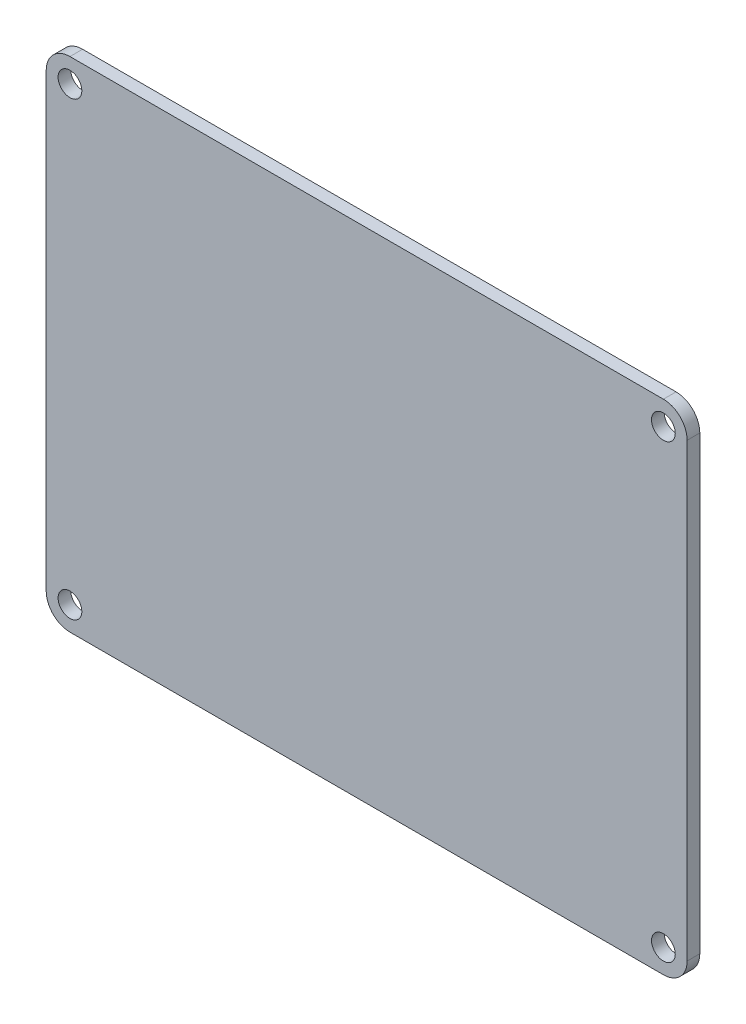
ISO-10303-21;
HEADER;
FILE_DESCRIPTION(('STEP AP214'),'2;1');
FILE_NAME('part.step','',(''),(''),'','','');
FILE_SCHEMA(('AUTOMOTIVE_DESIGN { 1 0 10303 214 1 1 1 1 }'));
ENDSEC;
DATA;
#1=APPLICATION_CONTEXT('core data for automotive mechanical design processes');
#2=APPLICATION_PROTOCOL_DEFINITION('international standard','automotive_design',2000,#1);
#3=PRODUCT_CONTEXT('',#1,'mechanical');
#4=PRODUCT('Part','Part','',(#3));
#5=PRODUCT_RELATED_PRODUCT_CATEGORY('part','',(#4));
#6=PRODUCT_DEFINITION_FORMATION('','',#4);
#7=PRODUCT_DEFINITION_CONTEXT('part definition',#1,'design');
#8=PRODUCT_DEFINITION('design','',#6,#7);
#9=PRODUCT_DEFINITION_SHAPE('','',#8);
#10=(LENGTH_UNIT() NAMED_UNIT(*) SI_UNIT(.MILLI.,.METRE.));
#11=(NAMED_UNIT(*) PLANE_ANGLE_UNIT() SI_UNIT($,.RADIAN.));
#12=(NAMED_UNIT(*) SI_UNIT($,.STERADIAN.) SOLID_ANGLE_UNIT());
#13=UNCERTAINTY_MEASURE_WITH_UNIT(LENGTH_MEASURE(1.E-05),#10,'distance_accuracy_value','');
#14=(GEOMETRIC_REPRESENTATION_CONTEXT(3) GLOBAL_UNCERTAINTY_ASSIGNED_CONTEXT((#13)) GLOBAL_UNIT_ASSIGNED_CONTEXT((#10,
#11,#12)) REPRESENTATION_CONTEXT('',''));
#15=CARTESIAN_POINT('',(0.,0.,0.));
#16=DIRECTION('',(0.,0.,1.));
#17=DIRECTION('',(1.,0.,0.));
#18=AXIS2_PLACEMENT_3D('',#15,#16,#17);
#19=CARTESIAN_POINT('',(-37.5,-28.5,1.6));
#20=DIRECTION('',(0.,0.,-1.));
#21=DIRECTION('',(-1.,0.,0.));
#22=AXIS2_PLACEMENT_3D('',#19,#20,#21);
#23=PLANE('',#22);
#24=CARTESIAN_POINT('',(-37.5,-28.5,1.6));
#25=DIRECTION('',(0.,0.,1.));
#26=DIRECTION('',(-1.,0.,0.));
#27=AXIS2_PLACEMENT_3D('',#24,#25,#26);
#28=CIRCLE('',#27,3.);
#29=CARTESIAN_POINT('',(-40.5,-28.5,1.6));
#30=VERTEX_POINT('',#29);
#31=CARTESIAN_POINT('',(-37.5,-31.5,1.6));
#32=VERTEX_POINT('',#31);
#33=EDGE_CURVE('E164',#30,#32,#28,.T.);
#34=ORIENTED_EDGE('',*,*,#33,.T.);
#35=DIRECTION('',(1.,0.,0.));
#36=VECTOR('',#35,1.);
#37=CARTESIAN_POINT('',(-37.5,-31.5,1.6));
#38=LINE('',#37,#36);
#39=CARTESIAN_POINT('',(37.5,-31.5,1.6));
#40=VERTEX_POINT('',#39);
#41=EDGE_CURVE('E100',#32,#40,#38,.T.);
#42=ORIENTED_EDGE('',*,*,#41,.T.);
#43=CARTESIAN_POINT('',(37.5,-28.5,1.6));
#44=DIRECTION('',(0.,0.,1.));
#45=DIRECTION('',(1.,0.,0.));
#46=AXIS2_PLACEMENT_3D('',#43,#44,#45);
#47=CIRCLE('',#46,3.);
#48=CARTESIAN_POINT('',(40.5,-28.5,1.6));
#49=VERTEX_POINT('',#48);
#50=EDGE_CURVE('E185',#40,#49,#47,.T.);
#51=ORIENTED_EDGE('',*,*,#50,.T.);
#52=DIRECTION('',(0.,1.,0.));
#53=VECTOR('',#52,1.);
#54=CARTESIAN_POINT('',(40.5,-28.5,1.6));
#55=LINE('',#54,#53);
#56=CARTESIAN_POINT('',(40.5,28.5,1.6));
#57=VERTEX_POINT('',#56);
#58=EDGE_CURVE('E199',#49,#57,#55,.T.);
#59=ORIENTED_EDGE('',*,*,#58,.T.);
#60=CARTESIAN_POINT('',(37.5,28.5,1.6));
#61=DIRECTION('',(0.,0.,1.));
#62=DIRECTION('',(-1.,0.,0.));
#63=AXIS2_PLACEMENT_3D('',#60,#61,#62);
#64=CIRCLE('',#63,3.);
#65=CARTESIAN_POINT('',(37.5,31.5,1.6));
#66=VERTEX_POINT('',#65);
#67=EDGE_CURVE('E119',#57,#66,#64,.T.);
#68=ORIENTED_EDGE('',*,*,#67,.T.);
#69=DIRECTION('',(-1.,0.,0.));
#70=VECTOR('',#69,1.);
#71=CARTESIAN_POINT('',(-37.5,31.5,1.6));
#72=LINE('',#71,#70);
#73=CARTESIAN_POINT('',(-37.5,31.5,1.6));
#74=VERTEX_POINT('',#73);
#75=EDGE_CURVE('E113',#66,#74,#72,.T.);
#76=ORIENTED_EDGE('',*,*,#75,.T.);
#77=CARTESIAN_POINT('',(-37.5,28.5,1.6));
#78=DIRECTION('',(0.,0.,1.));
#79=DIRECTION('',(-1.,0.,0.));
#80=AXIS2_PLACEMENT_3D('',#77,#78,#79);
#81=CIRCLE('',#80,3.);
#82=CARTESIAN_POINT('',(-40.5,28.5,1.6));
#83=VERTEX_POINT('',#82);
#84=EDGE_CURVE('E117',#74,#83,#81,.T.);
#85=ORIENTED_EDGE('',*,*,#84,.T.);
#86=DIRECTION('',(0.,-1.,0.));
#87=VECTOR('',#86,1.);
#88=CARTESIAN_POINT('',(-40.5,-28.5,1.6));
#89=LINE('',#88,#87);
#90=EDGE_CURVE('E57',#83,#30,#89,.T.);
#91=ORIENTED_EDGE('',*,*,#90,.T.);
#92=EDGE_LOOP('',(#34,#42,#51,#59,#68,#76,#85,#91));
#93=FACE_BOUND('',#92,.T.);
#94=CARTESIAN_POINT('',(-37.5,28.5,1.6));
#95=DIRECTION('',(0.,0.,1.));
#96=DIRECTION('',(1.,0.,0.));
#97=AXIS2_PLACEMENT_3D('',#94,#95,#96);
#98=CIRCLE('',#97,1.5);
#99=CARTESIAN_POINT('',(-36.,28.5,1.6));
#100=VERTEX_POINT('',#99);
#101=EDGE_CURVE('E146',#100,#100,#98,.T.);
#102=ORIENTED_EDGE('',*,*,#101,.F.);
#103=EDGE_LOOP('',(#102));
#104=FACE_BOUND('',#103,.T.);
#105=CARTESIAN_POINT('',(37.5,28.5,1.6));
#106=DIRECTION('',(0.,0.,1.));
#107=DIRECTION('',(1.,0.,0.));
#108=AXIS2_PLACEMENT_3D('',#105,#106,#107);
#109=CIRCLE('',#108,1.5);
#110=CARTESIAN_POINT('',(39.,28.5,1.6));
#111=VERTEX_POINT('',#110);
#112=EDGE_CURVE('E213',#111,#111,#109,.T.);
#113=ORIENTED_EDGE('',*,*,#112,.F.);
#114=EDGE_LOOP('',(#113));
#115=FACE_BOUND('',#114,.T.);
#116=CARTESIAN_POINT('',(37.5,-28.5,1.6));
#117=DIRECTION('',(0.,0.,1.));
#118=DIRECTION('',(1.,0.,0.));
#119=AXIS2_PLACEMENT_3D('',#116,#117,#118);
#120=CIRCLE('',#119,1.5);
#121=CARTESIAN_POINT('',(39.,-28.5,1.6));
#122=VERTEX_POINT('',#121);
#123=EDGE_CURVE('E221',#122,#122,#120,.T.);
#124=ORIENTED_EDGE('',*,*,#123,.F.);
#125=EDGE_LOOP('',(#124));
#126=FACE_BOUND('',#125,.T.);
#127=CARTESIAN_POINT('',(-37.5,-28.5,1.6));
#128=DIRECTION('',(0.,0.,1.));
#129=DIRECTION('',(1.,0.,0.));
#130=AXIS2_PLACEMENT_3D('',#127,#128,#129);
#131=CIRCLE('',#130,1.5);
#132=CARTESIAN_POINT('',(-36.,-28.5,1.6));
#133=VERTEX_POINT('',#132);
#134=EDGE_CURVE('E229',#133,#133,#131,.T.);
#135=ORIENTED_EDGE('',*,*,#134,.F.);
#136=EDGE_LOOP('',(#135));
#137=FACE_BOUND('',#136,.T.);
#138=ADVANCED_FACE('F39',(#93,#104,#115,#126,#137),#23,.F.);
#139=CARTESIAN_POINT('',(-37.5,-28.5,0.));
#140=DIRECTION('',(0.,0.,-1.));
#141=DIRECTION('',(-1.,0.,0.));
#142=AXIS2_PLACEMENT_3D('',#139,#140,#141);
#143=PLANE('',#142);
#144=CARTESIAN_POINT('',(37.5,-28.5,0.));
#145=DIRECTION('',(0.,0.,1.));
#146=DIRECTION('',(1.,0.,0.));
#147=AXIS2_PLACEMENT_3D('',#144,#145,#146);
#148=CIRCLE('',#147,1.5);
#149=CARTESIAN_POINT('',(39.,-28.5,0.));
#150=VERTEX_POINT('',#149);
#151=EDGE_CURVE('E225',#150,#150,#148,.T.);
#152=ORIENTED_EDGE('',*,*,#151,.T.);
#153=EDGE_LOOP('',(#152));
#154=FACE_BOUND('',#153,.T.);
#155=CARTESIAN_POINT('',(-37.5,28.5,0.));
#156=DIRECTION('',(0.,0.,1.));
#157=DIRECTION('',(1.,0.,0.));
#158=AXIS2_PLACEMENT_3D('',#155,#156,#157);
#159=CIRCLE('',#158,1.5);
#160=CARTESIAN_POINT('',(-36.,28.5,0.));
#161=VERTEX_POINT('',#160);
#162=EDGE_CURVE('E209',#161,#161,#159,.T.);
#163=ORIENTED_EDGE('',*,*,#162,.T.);
#164=EDGE_LOOP('',(#163));
#165=FACE_BOUND('',#164,.T.);
#166=CARTESIAN_POINT('',(-37.5,-28.5,0.));
#167=DIRECTION('',(0.,0.,1.));
#168=DIRECTION('',(-1.,0.,0.));
#169=AXIS2_PLACEMENT_3D('',#166,#167,#168);
#170=CIRCLE('',#169,3.);
#171=CARTESIAN_POINT('',(-40.5,-28.5,0.));
#172=VERTEX_POINT('',#171);
#173=CARTESIAN_POINT('',(-37.5,-31.5,0.));
#174=VERTEX_POINT('',#173);
#175=EDGE_CURVE('E141',#172,#174,#170,.T.);
#176=ORIENTED_EDGE('',*,*,#175,.F.);
#177=DIRECTION('',(0.,-1.,0.));
#178=VECTOR('',#177,1.);
#179=CARTESIAN_POINT('',(-40.5,-28.5,0.));
#180=LINE('',#179,#178);
#181=CARTESIAN_POINT('',(-40.5,28.5,0.));
#182=VERTEX_POINT('',#181);
#183=EDGE_CURVE('E92',#182,#172,#180,.T.);
#184=ORIENTED_EDGE('',*,*,#183,.F.);
#185=CARTESIAN_POINT('',(-37.5,28.5,0.));
#186=DIRECTION('',(0.,0.,1.));
#187=DIRECTION('',(-1.,0.,0.));
#188=AXIS2_PLACEMENT_3D('',#185,#186,#187);
#189=CIRCLE('',#188,3.);
#190=CARTESIAN_POINT('',(-37.5,31.5,0.));
#191=VERTEX_POINT('',#190);
#192=EDGE_CURVE('E86',#191,#182,#189,.T.);
#193=ORIENTED_EDGE('',*,*,#192,.F.);
#194=DIRECTION('',(-1.,0.,0.));
#195=VECTOR('',#194,1.);
#196=CARTESIAN_POINT('',(-37.5,31.5,0.));
#197=LINE('',#196,#195);
#198=CARTESIAN_POINT('',(37.5,31.5,0.));
#199=VERTEX_POINT('',#198);
#200=EDGE_CURVE('E128',#199,#191,#197,.T.);
#201=ORIENTED_EDGE('',*,*,#200,.F.);
#202=CARTESIAN_POINT('',(37.5,28.5,0.));
#203=DIRECTION('',(0.,0.,1.));
#204=DIRECTION('',(-1.,0.,0.));
#205=AXIS2_PLACEMENT_3D('',#202,#203,#204);
#206=CIRCLE('',#205,3.);
#207=CARTESIAN_POINT('',(40.5,28.5,0.));
#208=VERTEX_POINT('',#207);
#209=EDGE_CURVE('E155',#208,#199,#206,.T.);
#210=ORIENTED_EDGE('',*,*,#209,.F.);
#211=DIRECTION('',(0.,1.,0.));
#212=VECTOR('',#211,1.);
#213=CARTESIAN_POINT('',(40.5,-28.5,0.));
#214=LINE('',#213,#212);
#215=CARTESIAN_POINT('',(40.5,-28.5,0.));
#216=VERTEX_POINT('',#215);
#217=EDGE_CURVE('E152',#216,#208,#214,.T.);
#218=ORIENTED_EDGE('',*,*,#217,.F.);
#219=CARTESIAN_POINT('',(37.5,-28.5,0.));
#220=DIRECTION('',(0.,0.,1.));
#221=DIRECTION('',(1.,0.,0.));
#222=AXIS2_PLACEMENT_3D('',#219,#220,#221);
#223=CIRCLE('',#222,3.);
#224=CARTESIAN_POINT('',(37.5,-31.5,0.));
#225=VERTEX_POINT('',#224);
#226=EDGE_CURVE('E149',#225,#216,#223,.T.);
#227=ORIENTED_EDGE('',*,*,#226,.F.);
#228=DIRECTION('',(1.,0.,0.));
#229=VECTOR('',#228,1.);
#230=CARTESIAN_POINT('',(-37.5,-31.5,0.));
#231=LINE('',#230,#229);
#232=EDGE_CURVE('E145',#174,#225,#231,.T.);
#233=ORIENTED_EDGE('',*,*,#232,.F.);
#234=EDGE_LOOP('',(#176,#184,#193,#201,#210,#218,#227,#233));
#235=FACE_BOUND('',#234,.T.);
#236=CARTESIAN_POINT('',(37.5,28.5,0.));
#237=DIRECTION('',(0.,0.,1.));
#238=DIRECTION('',(1.,0.,0.));
#239=AXIS2_PLACEMENT_3D('',#236,#237,#238);
#240=CIRCLE('',#239,1.5);
#241=CARTESIAN_POINT('',(39.,28.5,0.));
#242=VERTEX_POINT('',#241);
#243=EDGE_CURVE('E217',#242,#242,#240,.T.);
#244=ORIENTED_EDGE('',*,*,#243,.T.);
#245=EDGE_LOOP('',(#244));
#246=FACE_BOUND('',#245,.T.);
#247=CARTESIAN_POINT('',(-37.5,-28.5,0.));
#248=DIRECTION('',(0.,0.,1.));
#249=DIRECTION('',(1.,0.,0.));
#250=AXIS2_PLACEMENT_3D('',#247,#248,#249);
#251=CIRCLE('',#250,1.5);
#252=CARTESIAN_POINT('',(-36.,-28.5,0.));
#253=VERTEX_POINT('',#252);
#254=EDGE_CURVE('E233',#253,#253,#251,.T.);
#255=ORIENTED_EDGE('',*,*,#254,.T.);
#256=EDGE_LOOP('',(#255));
#257=FACE_BOUND('',#256,.T.);
#258=ADVANCED_FACE('F189',(#154,#165,#235,#246,#257),#143,.T.);
#259=CARTESIAN_POINT('',(-37.5,-28.5,1.6));
#260=DIRECTION('',(0.,0.,-1.));
#261=DIRECTION('',(-1.,0.,0.));
#262=AXIS2_PLACEMENT_3D('',#259,#260,#261);
#263=CYLINDRICAL_SURFACE('',#262,3.);
#264=ORIENTED_EDGE('',*,*,#175,.T.);
#265=DIRECTION('',(0.,0.,-1.));
#266=VECTOR('',#265,1.);
#267=CARTESIAN_POINT('',(-37.5,-31.5,1.6));
#268=LINE('',#267,#266);
#269=EDGE_CURVE('E11',#32,#174,#268,.T.);
#270=ORIENTED_EDGE('',*,*,#269,.F.);
#271=ORIENTED_EDGE('',*,*,#33,.F.);
#272=DIRECTION('',(0.,0.,-1.));
#273=VECTOR('',#272,1.);
#274=CARTESIAN_POINT('',(-40.5,-28.5,1.6));
#275=LINE('',#274,#273);
#276=EDGE_CURVE('E137',#30,#172,#275,.T.);
#277=ORIENTED_EDGE('',*,*,#276,.T.);
#278=EDGE_LOOP('',(#264,#270,#271,#277));
#279=FACE_BOUND('',#278,.T.);
#280=ADVANCED_FACE('F41',(#279),#263,.T.);
#281=CARTESIAN_POINT('',(-37.5,-31.5,1.6));
#282=DIRECTION('',(0.,1.,0.));
#283=DIRECTION('',(0.,0.,1.));
#284=AXIS2_PLACEMENT_3D('',#281,#282,#283);
#285=PLANE('',#284);
#286=ORIENTED_EDGE('',*,*,#232,.T.);
#287=DIRECTION('',(0.,0.,-1.));
#288=VECTOR('',#287,1.);
#289=CARTESIAN_POINT('',(37.5,-31.5,1.6));
#290=LINE('',#289,#288);
#291=EDGE_CURVE('E49',#40,#225,#290,.T.);
#292=ORIENTED_EDGE('',*,*,#291,.F.);
#293=ORIENTED_EDGE('',*,*,#41,.F.);
#294=ORIENTED_EDGE('',*,*,#269,.T.);
#295=EDGE_LOOP('',(#286,#292,#293,#294));
#296=FACE_BOUND('',#295,.T.);
#297=ADVANCED_FACE('F267',(#296),#285,.F.);
#298=CARTESIAN_POINT('',(37.5,-28.5,1.6));
#299=DIRECTION('',(0.,0.,-1.));
#300=DIRECTION('',(-1.,0.,0.));
#301=AXIS2_PLACEMENT_3D('',#298,#299,#300);
#302=CYLINDRICAL_SURFACE('',#301,3.);
#303=ORIENTED_EDGE('',*,*,#226,.T.);
#304=DIRECTION('',(0.,0.,-1.));
#305=VECTOR('',#304,1.);
#306=CARTESIAN_POINT('',(40.5,-28.5,1.6));
#307=LINE('',#306,#305);
#308=EDGE_CURVE('E175',#49,#216,#307,.T.);
#309=ORIENTED_EDGE('',*,*,#308,.F.);
#310=ORIENTED_EDGE('',*,*,#50,.F.);
#311=ORIENTED_EDGE('',*,*,#291,.T.);
#312=EDGE_LOOP('',(#303,#309,#310,#311));
#313=FACE_BOUND('',#312,.T.);
#314=ADVANCED_FACE('F183',(#313),#302,.T.);
#315=CARTESIAN_POINT('',(40.5,-28.5,1.6));
#316=DIRECTION('',(-1.,0.,0.));
#317=DIRECTION('',(0.,0.,1.));
#318=AXIS2_PLACEMENT_3D('',#315,#316,#317);
#319=PLANE('',#318);
#320=ORIENTED_EDGE('',*,*,#217,.T.);
#321=DIRECTION('',(0.,0.,-1.));
#322=VECTOR('',#321,1.);
#323=CARTESIAN_POINT('',(40.5,28.5,1.6));
#324=LINE('',#323,#322);
#325=EDGE_CURVE('E171',#57,#208,#324,.T.);
#326=ORIENTED_EDGE('',*,*,#325,.F.);
#327=ORIENTED_EDGE('',*,*,#58,.F.);
#328=ORIENTED_EDGE('',*,*,#308,.T.);
#329=EDGE_LOOP('',(#320,#326,#327,#328));
#330=FACE_BOUND('',#329,.T.);
#331=ADVANCED_FACE('F194',(#330),#319,.F.);
#332=CARTESIAN_POINT('',(37.5,28.5,1.6));
#333=DIRECTION('',(0.,0.,-1.));
#334=DIRECTION('',(-1.,0.,0.));
#335=AXIS2_PLACEMENT_3D('',#332,#333,#334);
#336=CYLINDRICAL_SURFACE('',#335,3.);
#337=ORIENTED_EDGE('',*,*,#209,.T.);
#338=DIRECTION('',(0.,0.,-1.));
#339=VECTOR('',#338,1.);
#340=CARTESIAN_POINT('',(37.5,31.5,1.6));
#341=LINE('',#340,#339);
#342=EDGE_CURVE('E130',#66,#199,#341,.T.);
#343=ORIENTED_EDGE('',*,*,#342,.F.);
#344=ORIENTED_EDGE('',*,*,#67,.F.);
#345=ORIENTED_EDGE('',*,*,#325,.T.);
#346=EDGE_LOOP('',(#337,#343,#344,#345));
#347=FACE_BOUND('',#346,.T.);
#348=ADVANCED_FACE('F197',(#347),#336,.T.);
#349=CARTESIAN_POINT('',(-37.5,31.5,1.6));
#350=DIRECTION('',(0.,-1.,0.));
#351=DIRECTION('',(0.,0.,-1.));
#352=AXIS2_PLACEMENT_3D('',#349,#350,#351);
#353=PLANE('',#352);
#354=ORIENTED_EDGE('',*,*,#200,.T.);
#355=DIRECTION('',(0.,0.,-1.));
#356=VECTOR('',#355,1.);
#357=CARTESIAN_POINT('',(-37.5,31.5,1.6));
#358=LINE('',#357,#356);
#359=EDGE_CURVE('E125',#74,#191,#358,.T.);
#360=ORIENTED_EDGE('',*,*,#359,.F.);
#361=ORIENTED_EDGE('',*,*,#75,.F.);
#362=ORIENTED_EDGE('',*,*,#342,.T.);
#363=EDGE_LOOP('',(#354,#360,#361,#362));
#364=FACE_BOUND('',#363,.T.);
#365=ADVANCED_FACE('F126',(#364),#353,.F.);
#366=CARTESIAN_POINT('',(-37.5,28.5,1.6));
#367=DIRECTION('',(0.,0.,-1.));
#368=DIRECTION('',(-1.,0.,0.));
#369=AXIS2_PLACEMENT_3D('',#366,#367,#368);
#370=CYLINDRICAL_SURFACE('',#369,3.);
#371=ORIENTED_EDGE('',*,*,#192,.T.);
#372=DIRECTION('',(0.,0.,-1.));
#373=VECTOR('',#372,1.);
#374=CARTESIAN_POINT('',(-40.5,28.5,1.6));
#375=LINE('',#374,#373);
#376=EDGE_CURVE('E131',#83,#182,#375,.T.);
#377=ORIENTED_EDGE('',*,*,#376,.F.);
#378=ORIENTED_EDGE('',*,*,#84,.F.);
#379=ORIENTED_EDGE('',*,*,#359,.T.);
#380=EDGE_LOOP('',(#371,#377,#378,#379));
#381=FACE_BOUND('',#380,.T.);
#382=ADVANCED_FACE('F133',(#381),#370,.T.);
#383=CARTESIAN_POINT('',(-40.5,-28.5,1.6));
#384=DIRECTION('',(1.,0.,0.));
#385=DIRECTION('',(0.,0.,-1.));
#386=AXIS2_PLACEMENT_3D('',#383,#384,#385);
#387=PLANE('',#386);
#388=ORIENTED_EDGE('',*,*,#183,.T.);
#389=ORIENTED_EDGE('',*,*,#276,.F.);
#390=ORIENTED_EDGE('',*,*,#90,.F.);
#391=ORIENTED_EDGE('',*,*,#376,.T.);
#392=EDGE_LOOP('',(#388,#389,#390,#391));
#393=FACE_BOUND('',#392,.T.);
#394=ADVANCED_FACE('F255',(#393),#387,.F.);
#395=CARTESIAN_POINT('',(-37.5,28.5,1.6));
#396=DIRECTION('',(0.,0.,-1.));
#397=DIRECTION('',(-1.,0.,0.));
#398=AXIS2_PLACEMENT_3D('',#395,#396,#397);
#399=CYLINDRICAL_SURFACE('',#398,1.5);
#400=ORIENTED_EDGE('',*,*,#101,.T.);
#401=EDGE_LOOP('',(#400));
#402=FACE_BOUND('',#401,.T.);
#403=ORIENTED_EDGE('',*,*,#162,.F.);
#404=EDGE_LOOP('',(#403));
#405=FACE_BOUND('',#404,.T.);
#406=ADVANCED_FACE('F252',(#402,#405),#399,.F.);
#407=CARTESIAN_POINT('',(37.5,28.5,1.6));
#408=DIRECTION('',(0.,0.,-1.));
#409=DIRECTION('',(-1.,0.,0.));
#410=AXIS2_PLACEMENT_3D('',#407,#408,#409);
#411=CYLINDRICAL_SURFACE('',#410,1.5);
#412=ORIENTED_EDGE('',*,*,#112,.T.);
#413=EDGE_LOOP('',(#412));
#414=FACE_BOUND('',#413,.T.);
#415=ORIENTED_EDGE('',*,*,#243,.F.);
#416=EDGE_LOOP('',(#415));
#417=FACE_BOUND('',#416,.T.);
#418=ADVANCED_FACE('F331',(#414,#417),#411,.F.);
#419=CARTESIAN_POINT('',(37.5,-28.5,1.6));
#420=DIRECTION('',(0.,0.,-1.));
#421=DIRECTION('',(-1.,0.,0.));
#422=AXIS2_PLACEMENT_3D('',#419,#420,#421);
#423=CYLINDRICAL_SURFACE('',#422,1.5);
#424=ORIENTED_EDGE('',*,*,#123,.T.);
#425=EDGE_LOOP('',(#424));
#426=FACE_BOUND('',#425,.T.);
#427=ORIENTED_EDGE('',*,*,#151,.F.);
#428=EDGE_LOOP('',(#427));
#429=FACE_BOUND('',#428,.T.);
#430=ADVANCED_FACE('F339',(#426,#429),#423,.F.);
#431=CARTESIAN_POINT('',(-37.5,-28.5,1.6));
#432=DIRECTION('',(0.,0.,-1.));
#433=DIRECTION('',(-1.,0.,0.));
#434=AXIS2_PLACEMENT_3D('',#431,#432,#433);
#435=CYLINDRICAL_SURFACE('',#434,1.5);
#436=ORIENTED_EDGE('',*,*,#134,.T.);
#437=EDGE_LOOP('',(#436));
#438=FACE_BOUND('',#437,.T.);
#439=ORIENTED_EDGE('',*,*,#254,.F.);
#440=EDGE_LOOP('',(#439));
#441=FACE_BOUND('',#440,.T.);
#442=ADVANCED_FACE('F241',(#438,#441),#435,.F.);
#443=CLOSED_SHELL('',(#138,#258,#280,#297,#314,#331,#348,#365,#382,#394,#406,#418,#430,#442));
#444=MANIFOLD_SOLID_BREP('B2',#443);
#445=ADVANCED_BREP_SHAPE_REPRESENTATION('',(#18,#444),#14);
#446=SHAPE_DEFINITION_REPRESENTATION(#9,#445);
ENDSEC;
END-ISO-10303-21;
